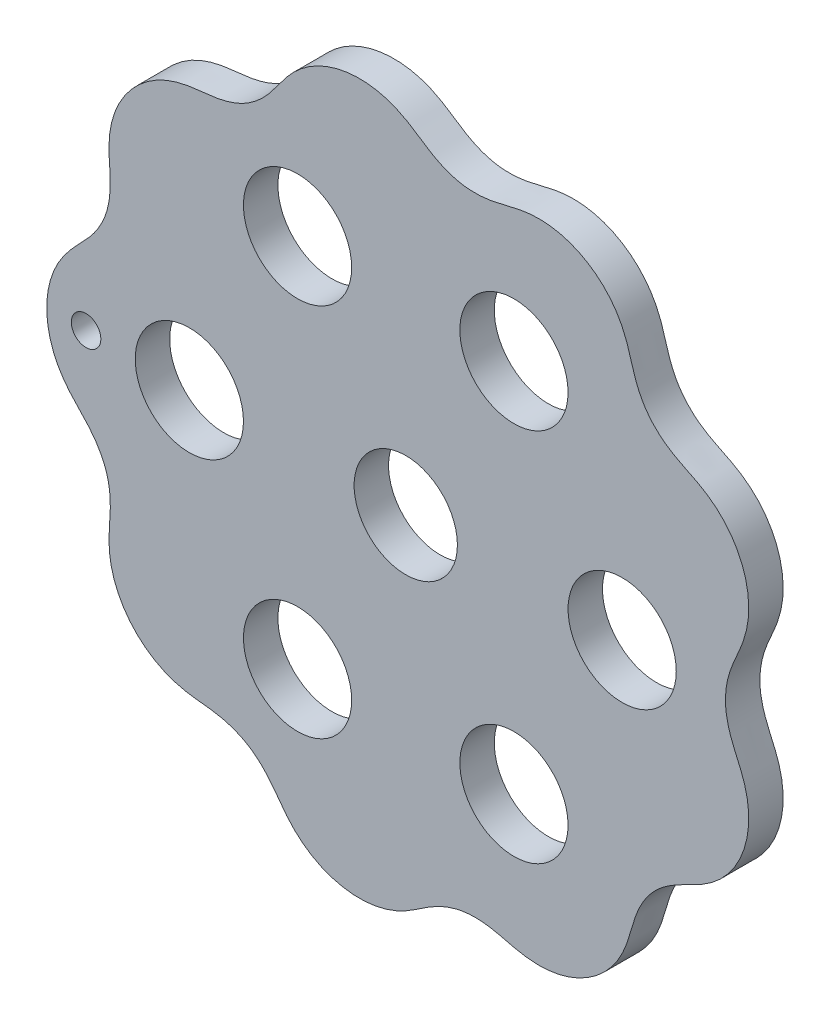
ISO-10303-21;
HEADER;
FILE_DESCRIPTION(('STEP AP214'),'2;1');
FILE_NAME('part.step','',(''),(''),'','','');
FILE_SCHEMA(('AUTOMOTIVE_DESIGN { 1 0 10303 214 1 1 1 1 }'));
ENDSEC;
DATA;
#1=APPLICATION_CONTEXT('core data for automotive mechanical design processes');
#2=APPLICATION_PROTOCOL_DEFINITION('international standard','automotive_design',2000,#1);
#3=PRODUCT_CONTEXT('',#1,'mechanical');
#4=PRODUCT('Part','Part','',(#3));
#5=PRODUCT_RELATED_PRODUCT_CATEGORY('part','',(#4));
#6=PRODUCT_DEFINITION_FORMATION('','',#4);
#7=PRODUCT_DEFINITION_CONTEXT('part definition',#1,'design');
#8=PRODUCT_DEFINITION('design','',#6,#7);
#9=PRODUCT_DEFINITION_SHAPE('','',#8);
#10=(LENGTH_UNIT() NAMED_UNIT(*) SI_UNIT(.MILLI.,.METRE.));
#11=(NAMED_UNIT(*) PLANE_ANGLE_UNIT() SI_UNIT($,.RADIAN.));
#12=(NAMED_UNIT(*) SI_UNIT($,.STERADIAN.) SOLID_ANGLE_UNIT());
#13=UNCERTAINTY_MEASURE_WITH_UNIT(LENGTH_MEASURE(1.E-05),#10,'distance_accuracy_value','');
#14=(GEOMETRIC_REPRESENTATION_CONTEXT(3) GLOBAL_UNCERTAINTY_ASSIGNED_CONTEXT((#13)) GLOBAL_UNIT_ASSIGNED_CONTEXT((#10,
#11,#12)) REPRESENTATION_CONTEXT('',''));
#15=CARTESIAN_POINT('',(0.,0.,0.));
#16=DIRECTION('',(0.,0.,1.));
#17=DIRECTION('',(1.,0.,0.));
#18=AXIS2_PLACEMENT_3D('',#15,#16,#17);
#19=CARTESIAN_POINT('',(64.9999974189462,0.000806947393206427,7.));
#20=CARTESIAN_POINT('',(65.0000060896665,0.210133120043708,7.));
#21=CARTESIAN_POINT('',(65.0075349477926,0.640540930359557,7.));
#22=CARTESIAN_POINT('',(65.0423326642726,1.29138048933978,7.));
#23=CARTESIAN_POINT('',(65.1355944950711,2.15946002252957,7.));
#24=CARTESIAN_POINT('',(65.2772488507312,3.03268000759289,7.));
#25=CARTESIAN_POINT('',(65.4938302034019,4.03856931783916,7.));
#26=CARTESIAN_POINT('',(65.8090879421548,5.16829321058666,7.));
#27=CARTESIAN_POINT('',(66.3609477002479,6.75838675332003,7.));
#28=CARTESIAN_POINT('',(67.1955606372477,8.68035398579398,7.));
#29=CARTESIAN_POINT('',(68.1863534579367,10.8265174950943,7.));
#30=CARTESIAN_POINT('',(69.006376801487,13.1310375512732,7.));
#31=CARTESIAN_POINT('',(69.4920834602597,15.232893555584,7.));
#32=CARTESIAN_POINT('',(69.7787041406788,17.6217517722098,7.));
#33=CARTESIAN_POINT('',(69.7585653837126,20.2836153044852,7.));
#34=CARTESIAN_POINT('',(69.2420504175532,23.3842825140304,7.));
#35=CARTESIAN_POINT('',(67.989755767463,26.7805165454868,7.));
#36=CARTESIAN_POINT('',(66.1003518112437,29.9050606071729,7.));
#37=CARTESIAN_POINT('',(63.9856429027027,32.2244319198111,7.));
#38=CARTESIAN_POINT('',(61.9631798684135,33.8331068866535,7.));
#39=CARTESIAN_POINT('',(59.9243572487797,35.1173421352973,7.));
#40=CARTESIAN_POINT('',(58.0026026370836,36.1114334246741,7.));
#41=CARTESIAN_POINT('',(55.7730199877424,37.1453350716986,7.));
#42=CARTESIAN_POINT('',(53.1577175576554,38.6272333252823,7.));
#43=CARTESIAN_POINT('',(50.6634327190039,40.6124441799345,7.));
#44=CARTESIAN_POINT('',(48.1772443412328,43.6331587744378,7.));
#45=CARTESIAN_POINT('',(46.5494493779002,47.2486226424222,7.));
#46=CARTESIAN_POINT('',(45.6788409974091,50.8530369439028,7.));
#47=CARTESIAN_POINT('',(44.4877142214285,54.37135741296,7.));
#48=CARTESIAN_POINT('',(42.9782258437172,57.2636357878246,7.));
#49=CARTESIAN_POINT('',(40.837389164635,60.0002248973357,7.));
#50=CARTESIAN_POINT('',(38.0491294232779,62.4028462274312,7.));
#51=CARTESIAN_POINT('',(34.8562595704566,64.2262648191676,7.));
#52=CARTESIAN_POINT('',(31.3749966284014,65.4055952018423,7.));
#53=CARTESIAN_POINT('',(27.9067164953287,65.8635360965851,7.));
#54=CARTESIAN_POINT('',(24.5909286352251,65.6863801751534,7.));
#55=CARTESIAN_POINT('',(21.6064914797643,65.0507962498969,7.));
#56=CARTESIAN_POINT('',(18.9163015216464,64.3230768301073,7.));
#57=CARTESIAN_POINT('',(15.9988246409172,63.774192758896,7.));
#58=CARTESIAN_POINT('',(12.8475847319798,63.6680287432577,7.));
#59=CARTESIAN_POINT('',(9.72881655560221,64.2151955286093,7.));
#60=CARTESIAN_POINT('',(6.80201603206665,65.3881481412251,7.));
#61=CARTESIAN_POINT('',(4.24637024670339,66.8988383222155,7.));
#62=CARTESIAN_POINT('',(1.96700879221362,68.5023935980808,7.));
#63=CARTESIAN_POINT('',(-0.618218867674531,70.1231580876928,7.));
#64=CARTESIAN_POINT('',(-3.67158622518901,71.4280302377859,7.));
#65=CARTESIAN_POINT('',(-7.08625472339014,72.188828977834,7.));
#66=CARTESIAN_POINT('',(-10.7607962504432,72.2764501479947,7.));
#67=CARTESIAN_POINT('',(-14.3856478065138,71.6600737291214,7.));
#68=CARTESIAN_POINT('',(-17.8292746131177,70.3608295334047,7.));
#69=CARTESIAN_POINT('',(-20.7796796781894,68.525713642821,7.));
#70=CARTESIAN_POINT('',(-23.1903735111349,66.3275587138377,7.));
#71=CARTESIAN_POINT('',(-25.5166432056723,63.4313883268779,7.));
#72=CARTESIAN_POINT('',(-27.5658981043485,60.3412686281254,7.));
#73=CARTESIAN_POINT('',(-30.3273071823254,57.4961890293646,7.));
#74=CARTESIAN_POINT('',(-33.6934020938998,55.5025400677718,7.));
#75=CARTESIAN_POINT('',(-36.7146686583335,54.4848557995489,7.));
#76=CARTESIAN_POINT('',(-39.3098157041857,54.0464745085796,7.));
#77=CARTESIAN_POINT('',(-41.3839831679042,53.8369304022008,7.));
#78=CARTESIAN_POINT('',(-43.1619113314944,53.6422788237784,7.));
#79=CARTESIAN_POINT('',(-44.638619490762,53.4200818386609,7.));
#80=CARTESIAN_POINT('',(-46.6290143200991,52.9928867622821,7.));
#81=CARTESIAN_POINT('',(-49.0810187762695,52.1759075026816,7.));
#82=CARTESIAN_POINT('',(-51.8634319117081,50.7240398876037,7.));
#83=CARTESIAN_POINT('',(-54.7375351891168,48.4164840592304,7.));
#84=CARTESIAN_POINT('',(-57.1177551209098,45.5983896518703,7.));
#85=CARTESIAN_POINT('',(-58.9151842364942,42.3728498221085,7.));
#86=CARTESIAN_POINT('',(-59.9875054812709,39.0487290248223,7.));
#87=CARTESIAN_POINT('',(-60.406669899066,35.79071175248,7.));
#88=CARTESIAN_POINT('',(-60.3255510791938,32.7522342108345,7.));
#89=CARTESIAN_POINT('',(-60.0723296855861,29.9660658894175,7.));
#90=CARTESIAN_POINT('',(-60.0137605173139,26.9590132260123,7.));
#91=CARTESIAN_POINT('',(-60.4507873217953,23.766104629994,7.));
#92=CARTESIAN_POINT('',(-61.5496316373744,20.7237531942153,7.));
#93=CARTESIAN_POINT('',(-63.2537764880858,17.9881793859017,7.));
#94=CARTESIAN_POINT('',(-64.989814092561,15.9871600919805,7.));
#95=CARTESIAN_POINT('',(-66.4470329388372,14.4993768041449,7.));
#96=CARTESIAN_POINT('',(-67.6572058913901,13.2246424716252,7.));
#97=CARTESIAN_POINT('',(-68.5996720386976,12.146432902912,7.));
#98=CARTESIAN_POINT('',(-69.5367739893671,10.9320496532846,7.));
#99=CARTESIAN_POINT('',(-70.4328124052768,9.56352253746906,7.));
#100=CARTESIAN_POINT('',(-71.2499826492614,8.02969432082017,7.));
#101=CARTESIAN_POINT('',(-71.9504383846823,6.32905817664915,7.));
#102=CARTESIAN_POINT('',(-72.4801341328205,4.56774841811237,7.));
#103=CARTESIAN_POINT('',(-72.835401263682,2.76323725210516,7.));
#104=CARTESIAN_POINT('',(-72.969755124668,1.3873552731175,7.));
#105=CARTESIAN_POINT('',(-72.99987629454,0.466180194334638,7.));
#106=CARTESIAN_POINT('',(-72.9999998938307,0.00404841223115982,7.));
#107=CARTESIAN_POINT('',(-73.0000000524441,0.000971905902284116,7.));
#108=CARTESIAN_POINT('',(-73.0000000607955,0.000809921588441405,7.));
#109=CARTESIAN_POINT('',(-73.0000000673054,0.00064793727450376,7.));
#110=CARTESIAN_POINT('',(-73.0000000766209,0.000323968646429011,7.));
#111=CARTESIAN_POINT('',(-73.000000078484,1.79361577428399E-11,7.));
#112=CARTESIAN_POINT('',(-73.0000000766209,-0.000323968610556695,7.));
#113=CARTESIAN_POINT('',(-73.0000000673054,-0.000647937238631444,7.));
#114=CARTESIAN_POINT('',(-73.0000000607955,-0.000809921552569089,7.));
#115=CARTESIAN_POINT('',(-73.0000000524442,-0.000971905865254023,7.));
#116=CARTESIAN_POINT('',(-72.9999998938307,-0.00404841219528758,7.));
#117=CARTESIAN_POINT('',(-72.9998762945401,-0.466180194298766,7.));
#118=CARTESIAN_POINT('',(-72.9697551246683,-1.38735527308164,7.));
#119=CARTESIAN_POINT('',(-72.8354012636827,-2.76323725206933,7.));
#120=CARTESIAN_POINT('',(-72.4801341328217,-4.56774841807664,7.));
#121=CARTESIAN_POINT('',(-71.950438384684,-6.32905817661355,7.));
#122=CARTESIAN_POINT('',(-71.2499826492635,-8.02969432078475,7.));
#123=CARTESIAN_POINT('',(-70.4328124052793,-9.56352253743386,7.));
#124=CARTESIAN_POINT('',(-69.53677398937,-10.9320496532497,7.));
#125=CARTESIAN_POINT('',(-68.5996720387008,-12.1464329028773,7.));
#126=CARTESIAN_POINT('',(-67.6572058913936,-13.2246424715907,7.));
#127=CARTESIAN_POINT('',(-66.447032938841,-14.4993768041108,7.));
#128=CARTESIAN_POINT('',(-64.9898140925653,-15.9871600919467,7.));
#129=CARTESIAN_POINT('',(-63.2537764880906,-17.9881793858683,7.));
#130=CARTESIAN_POINT('',(-61.5496316373799,-20.7237531941824,7.));
#131=CARTESIAN_POINT('',(-60.4507873218015,-23.7661046299614,7.));
#132=CARTESIAN_POINT('',(-60.013760517321,-26.9590132259799,7.));
#133=CARTESIAN_POINT('',(-60.0723296855939,-29.966065889385,7.));
#134=CARTESIAN_POINT('',(-60.3255510792024,-32.7522342108019,7.));
#135=CARTESIAN_POINT('',(-60.4066698990754,-35.7907117524475,7.));
#136=CARTESIAN_POINT('',(-59.9875054812811,-39.0487290247898,7.));
#137=CARTESIAN_POINT('',(-58.9151842365053,-42.3728498220763,7.));
#138=CARTESIAN_POINT('',(-57.1177551209218,-45.5983896518386,7.));
#139=CARTESIAN_POINT('',(-54.7375351891296,-48.4164840591993,7.));
#140=CARTESIAN_POINT('',(-51.8634319117215,-50.7240398875733,7.));
#141=CARTESIAN_POINT('',(-49.0810187762832,-52.175907502652,7.));
#142=CARTESIAN_POINT('',(-46.629014320113,-52.9928867622531,7.));
#143=CARTESIAN_POINT('',(-44.6386194907761,-53.4200818386325,7.));
#144=CARTESIAN_POINT('',(-43.1619113315086,-53.6422788237504,7.));
#145=CARTESIAN_POINT('',(-41.3839831679183,-53.8369304021733,7.));
#146=CARTESIAN_POINT('',(-39.3098157041999,-54.0464745085526,7.));
#147=CARTESIAN_POINT('',(-36.7146686583478,-54.4848557995226,7.));
#148=CARTESIAN_POINT('',(-33.6934020939144,-55.5025400677462,7.));
#149=CARTESIAN_POINT('',(-30.3273071823405,-57.4961890293399,7.));
#150=CARTESIAN_POINT('',(-27.5658981043644,-60.3412686281015,7.));
#151=CARTESIAN_POINT('',(-25.516643205689,-63.4313883268545,7.));
#152=CARTESIAN_POINT('',(-23.1903735111523,-66.3275587138149,7.));
#153=CARTESIAN_POINT('',(-20.7796796782074,-68.5257136427989,7.));
#154=CARTESIAN_POINT('',(-17.8292746131362,-70.3608295333833,7.));
#155=CARTESIAN_POINT('',(-14.3856478065326,-71.660073729101,7.));
#156=CARTESIAN_POINT('',(-10.7607962504622,-72.2764501479752,7.));
#157=CARTESIAN_POINT('',(-7.08625472340912,-72.1888289778155,7.));
#158=CARTESIAN_POINT('',(-3.67158622520779,-71.4280302377683,7.));
#159=CARTESIAN_POINT('',(-0.618218867692968,-70.123158087676,7.));
#160=CARTESIAN_POINT('',(1.96700879219561,-68.5023935980646,7.));
#161=CARTESIAN_POINT('',(4.2463702466858,-66.8988383221999,7.));
#162=CARTESIAN_POINT('',(6.80201603204946,-65.3881481412102,7.));
#163=CARTESIAN_POINT('',(9.72881655558533,-64.2151955285952,7.));
#164=CARTESIAN_POINT('',(12.8475847319631,-63.6680287432444,7.));
#165=CARTESIAN_POINT('',(15.9988246409004,-63.7741927588835,7.));
#166=CARTESIAN_POINT('',(18.9163015216295,-64.3230768300955,7.));
#167=CARTESIAN_POINT('',(21.6064914797472,-65.0507962498859,7.));
#168=CARTESIAN_POINT('',(24.5909286352079,-65.6863801751432,7.));
#169=CARTESIAN_POINT('',(27.9067164953114,-65.8635360965757,7.));
#170=CARTESIAN_POINT('',(31.3749966283842,-65.4055952018339,7.));
#171=CARTESIAN_POINT('',(34.8562595704397,-64.2262648191601,7.));
#172=CARTESIAN_POINT('',(38.0491294232615,-62.4028462274245,7.));
#173=CARTESIAN_POINT('',(40.8373891646192,-60.0002248973298,7.));
#174=CARTESIAN_POINT('',(42.9782258437022,-57.2636357878192,7.));
#175=CARTESIAN_POINT('',(44.4877142214142,-54.371357412955,7.));
#176=CARTESIAN_POINT('',(45.6788409973957,-50.8530369438981,7.));
#177=CARTESIAN_POINT('',(46.5494493778878,-47.2486226424178,7.));
#178=CARTESIAN_POINT('',(48.1772443412213,-43.6331587744338,7.));
#179=CARTESIAN_POINT('',(50.6634327189932,-40.6124441799311,7.));
#180=CARTESIAN_POINT('',(53.1577175576452,-38.6272333252796,7.));
#181=CARTESIAN_POINT('',(55.7730199877326,-37.1453350716966,7.));
#182=CARTESIAN_POINT('',(58.0026026370741,-36.1114334246727,7.));
#183=CARTESIAN_POINT('',(59.9243572487705,-35.1173421352963,7.));
#184=CARTESIAN_POINT('',(61.9631798684046,-33.8331068866531,7.));
#185=CARTESIAN_POINT('',(63.9856429026942,-32.2244319198112,7.));
#186=CARTESIAN_POINT('',(66.1003518112358,-29.9050606071735,7.));
#187=CARTESIAN_POINT('',(67.9897557674559,-26.780516545488,7.));
#188=CARTESIAN_POINT('',(69.242050417547,-23.3842825140319,7.));
#189=CARTESIAN_POINT('',(69.7585653837073,-20.2836153044868,7.));
#190=CARTESIAN_POINT('',(69.7787041406742,-17.6217517722115,7.));
#191=CARTESIAN_POINT('',(69.4920834602557,-15.2328935555856,7.));
#192=CARTESIAN_POINT('',(69.0063768014836,-13.1310375512746,7.));
#193=CARTESIAN_POINT('',(68.1863534579339,-10.8265174950955,7.));
#194=CARTESIAN_POINT('',(67.1955606372454,-8.68035398579494,7.));
#195=CARTESIAN_POINT('',(66.3609477002461,-6.75838675332078,7.));
#196=CARTESIAN_POINT('',(65.8090879421534,-5.16829321058725,7.));
#197=CARTESIAN_POINT('',(65.4938302034009,-4.03856931783967,7.));
#198=CARTESIAN_POINT('',(65.2772488507304,-3.03268000759335,7.));
#199=CARTESIAN_POINT('',(65.1355944950705,-2.15946002252999,7.));
#200=CARTESIAN_POINT('',(65.0423326642722,-1.29138048934017,7.));
#201=CARTESIAN_POINT('',(65.0075349477925,-0.640540930359938,7.));
#202=CARTESIAN_POINT('',(65.0000060896664,-0.210133120044085,7.));
#203=CARTESIAN_POINT('',(64.9999974189462,-0.000806947393581314,7.));
#204=CARTESIAN_POINT('',(64.9999974133753,-0.000672456161464381,7.));
#205=CARTESIAN_POINT('',(64.9999974093124,-0.000537964929284987,7.));
#206=CARTESIAN_POINT('',(64.9999974037974,-0.00026898246482123,7.));
#207=CARTESIAN_POINT('',(64.9999974026943,-1.8744353402282E-13,7.));
#208=CARTESIAN_POINT('',(64.9999974037973,0.000268982464446343,7.));
#209=CARTESIAN_POINT('',(64.9999974093124,0.0005379649289101,7.));
#210=CARTESIAN_POINT('',(64.9999974133753,0.000672456161089494,7.));
#211=CARTESIAN_POINT('',(64.9999974189462,0.000806947393206427,7.));
#212=B_SPLINE_CURVE_WITH_KNOTS('',4,(#19,#20,#21,#22,#23,#24,#25,#26,#27,#28,#29,#30,#31,#32,
#33,#34,#35,#36,#37,#38,#39,#40,#41,#42,#43,#44,#45,#46,#47,#48,#49,#50,#51,#52,#53,#54,#55,#56,
#57,#58,#59,#60,#61,#62,#63,#64,#65,#66,#67,#68,#69,#70,#71,#72,#73,#74,#75,#76,#77,#78,#79,#80,
#81,#82,#83,#84,#85,#86,#87,#88,#89,#90,#91,#92,#93,#94,#95,#96,#97,#98,#99,#100,#101,#102,#103,
#104,#105,#106,#107,#108,#109,#110,#111,#112,#113,#114,#115,#116,#117,#118,#119,#120,#121,#122,
#123,#124,#125,#126,#127,#128,#129,#130,#131,#132,#133,#134,#135,#136,#137,#138,#139,#140,#141,
#142,#143,#144,#145,#146,#147,#148,#149,#150,#151,#152,#153,#154,#155,#156,#157,#158,#159,#160,
#161,#162,#163,#164,#165,#166,#167,#168,#169,#170,#171,#172,#173,#174,#175,#176,#177,#178,#179,
#180,#181,#182,#183,#184,#185,#186,#187,#188,#189,#190,#191,#192,#193,#194,#195,#196,#197,#198,
#199,#200,#201,#202,#203,#204,#205,#206,#207,#208,#209,#210,#211),.UNSPECIFIED.,.T.,.F.,(5,1,1,
1,1,1,1,1,1,1,1,1,1,1,1,1,1,1,1,1,1,1,1,1,1,1,1,1,1,1,1,1,1,1,1,1,1,1,1,1,1,1,1,1,1,1,1,1,1,1,1,
1,1,1,1,1,1,1,1,1,1,1,1,1,1,1,1,1,1,1,1,1,1,1,1,1,1,1,1,1,1,1,1,1,1,4,2,2,4,1,1,1,1,1,1,1,1,1,1,
1,1,1,1,1,1,1,1,1,1,1,1,1,1,1,1,1,1,1,1,1,1,1,1,1,1,1,1,1,1,1,1,1,1,1,1,1,1,1,1,1,1,1,1,1,1,1,1,
1,1,1,1,1,1,1,1,1,1,1,1,1,1,1,1,1,1,1,1,1,1,1,1,1,1,4,2,2,5),(0.,0.00179877679357395,
0.00369860318866866,0.00559842958376338,0.0074982559788581,0.00939808237395283,
0.0125354173057919,0.015672752237631,0.0219474221013093,0.0273968380286471,0.032846253955985,
0.036645322562363,0.0404443911687411,0.0480417138040207,0.0556394037325636,0.0635014330407862,
0.0713638329503387,0.0792260579401196,0.0824323907924654,0.0856387236448112,0.0920513893495028,
0.0978019915695772,0.103552593789651,0.111417655754904,0.119282982658091,0.131114720690952,
0.13719636747454,0.143278014258127,0.151140148936298,0.159002594053197,0.166864609699459,
0.17470558558049,0.182546938898735,0.190388195673256,0.196737093948422,0.203085992223588,
0.208716670757051,0.214347349290514,0.222191946311898,0.230036411362514,0.235667158889129,
0.241297906415744,0.24764682768202,0.253995748948295,0.261837004604368,0.269678346555616,
0.277519325419182,0.285381338387372,0.293243790997148,0.301105902295292,0.307187582450527,
0.313269262605762,0.325100906035947,0.332966248770787,0.340831069770045,0.346581786892535,
0.352332504015025,0.35553884588345,0.358745187751876,0.361951529620301,0.365157871488727,
0.37302010918035,0.380882498425008,0.388744530518058,0.396634104342138,0.404524031544877,
0.412413637757737,0.418564341599305,0.424715045440873,0.430589756447976,0.436464467455079,
0.444357156095167,0.452249356514838,0.458124313656491,0.463999270798145,0.467074598109372,
0.470149925420598,0.473225252731825,0.476300580043052,0.48024542152947,0.484190263015888,
0.488135211230797,0.492080159445706,0.496024950319041,0.499969741192377,0.499996178474609,
0.499997570451275,0.49999896242794,0.500000354404606,0.500026791686838,0.503971582560174,
0.507916373433509,0.511861321648418,0.515806269863328,0.519751111349746,0.523695952836164,
0.52677128014739,0.529846607458617,0.532921934769844,0.535997262081071,0.541872219222724,
0.547747176364378,0.555639376784049,0.563532065424137,0.569406776431241,0.575281487438344,
0.581432191279912,0.58758289512148,0.59547250133434,0.603362428537079,0.611252002361159,
0.619114034454209,0.626976423698868,0.634838661390491,0.638045003258917,0.641251345127342,
0.644457686995768,0.647664028864193,0.653414745986683,0.659165463109173,0.667030284108431,
0.674895626843271,0.686727270273457,0.692808950428692,0.698890630583927,0.706752741882072,
0.714615194491847,0.722477207460038,0.730318186323604,0.738159528274852,0.746000783930925,
0.752349705197201,0.758698626463477,0.764329373990092,0.769960121516707,0.777804586567323,
0.785649183588708,0.791279862122171,0.796910540655634,0.803259438930799,0.809608337205965,
0.817449593980487,0.825290947298732,0.833131923179763,0.840993938826025,0.848856383942924,
0.856718518621095,0.862800165404683,0.868881812188271,0.880713550221132,0.888578877124319,
0.896443939089572,0.902194541309646,0.907945143529721,0.914357809234413,0.917564142086758,
0.920770474939104,0.928632699928885,0.936495099838438,0.944357129146661,0.951954819075204,
0.959552141710484,0.963351210316862,0.96715027892324,0.972599694850578,0.978049110777916,
0.984323780641594,0.987461115573433,0.990598450505273,0.992498276900367,0.994398103295462,
0.996297929690557,0.998197756085651,0.999996532879226,0.99999768858615,0.999998844293075,1.),.UNSPECIFIED.);
#213=DIRECTION('',(0.,0.,-1.));
#214=VECTOR('',#213,1.);
#215=SURFACE_OF_LINEAR_EXTRUSION('',#212,#214);
#216=CARTESIAN_POINT('',(64.9999974189462,0.000806947393206427,7.));
#217=VERTEX_POINT('',#216);
#218=EDGE_CURVE('E10',#217,#217,#212,.T.);
#219=ORIENTED_EDGE('',*,*,#218,.F.);
#220=EDGE_LOOP('',(#219));
#221=FACE_BOUND('',#220,.T.);
#222=CARTESIAN_POINT('',(64.9999974189462,0.000806947393206427,0.));
#223=CARTESIAN_POINT('',(65.0000060896665,0.210133120043708,0.));
#224=CARTESIAN_POINT('',(65.0075349477926,0.640540930359557,0.));
#225=CARTESIAN_POINT('',(65.0423326642726,1.29138048933978,0.));
#226=CARTESIAN_POINT('',(65.1355944950711,2.15946002252957,0.));
#227=CARTESIAN_POINT('',(65.2772488507312,3.03268000759289,0.));
#228=CARTESIAN_POINT('',(65.4938302034019,4.03856931783916,0.));
#229=CARTESIAN_POINT('',(65.8090879421548,5.16829321058666,0.));
#230=CARTESIAN_POINT('',(66.3609477002479,6.75838675332003,0.));
#231=CARTESIAN_POINT('',(67.1955606372477,8.68035398579398,0.));
#232=CARTESIAN_POINT('',(68.1863534579367,10.8265174950943,0.));
#233=CARTESIAN_POINT('',(69.006376801487,13.1310375512732,0.));
#234=CARTESIAN_POINT('',(69.4920834602597,15.232893555584,0.));
#235=CARTESIAN_POINT('',(69.7787041406788,17.6217517722098,0.));
#236=CARTESIAN_POINT('',(69.7585653837126,20.2836153044852,0.));
#237=CARTESIAN_POINT('',(69.2420504175532,23.3842825140304,0.));
#238=CARTESIAN_POINT('',(67.989755767463,26.7805165454868,0.));
#239=CARTESIAN_POINT('',(66.1003518112437,29.9050606071729,0.));
#240=CARTESIAN_POINT('',(63.9856429027027,32.2244319198111,0.));
#241=CARTESIAN_POINT('',(61.9631798684135,33.8331068866535,0.));
#242=CARTESIAN_POINT('',(59.9243572487797,35.1173421352973,0.));
#243=CARTESIAN_POINT('',(58.0026026370836,36.1114334246741,0.));
#244=CARTESIAN_POINT('',(55.7730199877424,37.1453350716986,0.));
#245=CARTESIAN_POINT('',(53.1577175576554,38.6272333252823,0.));
#246=CARTESIAN_POINT('',(50.6634327190039,40.6124441799345,0.));
#247=CARTESIAN_POINT('',(48.1772443412328,43.6331587744378,0.));
#248=CARTESIAN_POINT('',(46.5494493779002,47.2486226424222,0.));
#249=CARTESIAN_POINT('',(45.6788409974091,50.8530369439028,0.));
#250=CARTESIAN_POINT('',(44.4877142214285,54.37135741296,0.));
#251=CARTESIAN_POINT('',(42.9782258437172,57.2636357878246,0.));
#252=CARTESIAN_POINT('',(40.837389164635,60.0002248973357,0.));
#253=CARTESIAN_POINT('',(38.0491294232779,62.4028462274312,0.));
#254=CARTESIAN_POINT('',(34.8562595704566,64.2262648191676,0.));
#255=CARTESIAN_POINT('',(31.3749966284014,65.4055952018423,0.));
#256=CARTESIAN_POINT('',(27.9067164953287,65.8635360965851,0.));
#257=CARTESIAN_POINT('',(24.5909286352251,65.6863801751534,0.));
#258=CARTESIAN_POINT('',(21.6064914797643,65.0507962498969,0.));
#259=CARTESIAN_POINT('',(18.9163015216464,64.3230768301073,0.));
#260=CARTESIAN_POINT('',(15.9988246409172,63.774192758896,0.));
#261=CARTESIAN_POINT('',(12.8475847319798,63.6680287432577,0.));
#262=CARTESIAN_POINT('',(9.72881655560221,64.2151955286093,0.));
#263=CARTESIAN_POINT('',(6.80201603206665,65.3881481412251,0.));
#264=CARTESIAN_POINT('',(4.24637024670339,66.8988383222155,0.));
#265=CARTESIAN_POINT('',(1.96700879221362,68.5023935980808,0.));
#266=CARTESIAN_POINT('',(-0.618218867674531,70.1231580876928,0.));
#267=CARTESIAN_POINT('',(-3.67158622518901,71.4280302377859,0.));
#268=CARTESIAN_POINT('',(-7.08625472339014,72.188828977834,0.));
#269=CARTESIAN_POINT('',(-10.7607962504432,72.2764501479947,0.));
#270=CARTESIAN_POINT('',(-14.3856478065138,71.6600737291214,0.));
#271=CARTESIAN_POINT('',(-17.8292746131177,70.3608295334047,0.));
#272=CARTESIAN_POINT('',(-20.7796796781894,68.525713642821,0.));
#273=CARTESIAN_POINT('',(-23.1903735111349,66.3275587138377,0.));
#274=CARTESIAN_POINT('',(-25.5166432056723,63.4313883268779,0.));
#275=CARTESIAN_POINT('',(-27.5658981043485,60.3412686281254,0.));
#276=CARTESIAN_POINT('',(-30.3273071823254,57.4961890293646,0.));
#277=CARTESIAN_POINT('',(-33.6934020938998,55.5025400677718,0.));
#278=CARTESIAN_POINT('',(-36.7146686583335,54.4848557995489,0.));
#279=CARTESIAN_POINT('',(-39.3098157041857,54.0464745085796,0.));
#280=CARTESIAN_POINT('',(-41.3839831679042,53.8369304022008,0.));
#281=CARTESIAN_POINT('',(-43.1619113314944,53.6422788237784,0.));
#282=CARTESIAN_POINT('',(-44.638619490762,53.4200818386609,0.));
#283=CARTESIAN_POINT('',(-46.6290143200991,52.9928867622821,0.));
#284=CARTESIAN_POINT('',(-49.0810187762695,52.1759075026816,0.));
#285=CARTESIAN_POINT('',(-51.8634319117081,50.7240398876037,0.));
#286=CARTESIAN_POINT('',(-54.7375351891168,48.4164840592304,0.));
#287=CARTESIAN_POINT('',(-57.1177551209098,45.5983896518703,0.));
#288=CARTESIAN_POINT('',(-58.9151842364942,42.3728498221085,0.));
#289=CARTESIAN_POINT('',(-59.9875054812709,39.0487290248223,0.));
#290=CARTESIAN_POINT('',(-60.406669899066,35.79071175248,0.));
#291=CARTESIAN_POINT('',(-60.3255510791938,32.7522342108345,0.));
#292=CARTESIAN_POINT('',(-60.0723296855861,29.9660658894175,0.));
#293=CARTESIAN_POINT('',(-60.0137605173139,26.9590132260123,0.));
#294=CARTESIAN_POINT('',(-60.4507873217953,23.766104629994,0.));
#295=CARTESIAN_POINT('',(-61.5496316373744,20.7237531942153,0.));
#296=CARTESIAN_POINT('',(-63.2537764880858,17.9881793859017,0.));
#297=CARTESIAN_POINT('',(-64.989814092561,15.9871600919805,0.));
#298=CARTESIAN_POINT('',(-66.4470329388372,14.4993768041449,0.));
#299=CARTESIAN_POINT('',(-67.6572058913901,13.2246424716252,0.));
#300=CARTESIAN_POINT('',(-68.5996720386976,12.146432902912,0.));
#301=CARTESIAN_POINT('',(-69.5367739893671,10.9320496532846,0.));
#302=CARTESIAN_POINT('',(-70.4328124052768,9.56352253746906,0.));
#303=CARTESIAN_POINT('',(-71.2499826492614,8.02969432082017,0.));
#304=CARTESIAN_POINT('',(-71.9504383846823,6.32905817664915,0.));
#305=CARTESIAN_POINT('',(-72.4801341328205,4.56774841811237,0.));
#306=CARTESIAN_POINT('',(-72.835401263682,2.76323725210516,0.));
#307=CARTESIAN_POINT('',(-72.969755124668,1.3873552731175,0.));
#308=CARTESIAN_POINT('',(-72.99987629454,0.466180194334638,0.));
#309=CARTESIAN_POINT('',(-72.9999998938307,0.00404841223115982,0.));
#310=CARTESIAN_POINT('',(-73.0000000524441,0.000971905902284116,0.));
#311=CARTESIAN_POINT('',(-73.0000000607955,0.000809921588441405,0.));
#312=CARTESIAN_POINT('',(-73.0000000673054,0.00064793727450376,0.));
#313=CARTESIAN_POINT('',(-73.0000000766209,0.000323968646429011,0.));
#314=CARTESIAN_POINT('',(-73.000000078484,1.79361577428399E-11,0.));
#315=CARTESIAN_POINT('',(-73.0000000766209,-0.000323968610556695,0.));
#316=CARTESIAN_POINT('',(-73.0000000673054,-0.000647937238631444,0.));
#317=CARTESIAN_POINT('',(-73.0000000607955,-0.000809921552569089,0.));
#318=CARTESIAN_POINT('',(-73.0000000524442,-0.000971905865254023,0.));
#319=CARTESIAN_POINT('',(-72.9999998938307,-0.00404841219528758,0.));
#320=CARTESIAN_POINT('',(-72.9998762945401,-0.466180194298766,0.));
#321=CARTESIAN_POINT('',(-72.9697551246683,-1.38735527308164,0.));
#322=CARTESIAN_POINT('',(-72.8354012636827,-2.76323725206933,0.));
#323=CARTESIAN_POINT('',(-72.4801341328217,-4.56774841807664,0.));
#324=CARTESIAN_POINT('',(-71.950438384684,-6.32905817661355,0.));
#325=CARTESIAN_POINT('',(-71.2499826492635,-8.02969432078475,0.));
#326=CARTESIAN_POINT('',(-70.4328124052793,-9.56352253743386,0.));
#327=CARTESIAN_POINT('',(-69.53677398937,-10.9320496532497,0.));
#328=CARTESIAN_POINT('',(-68.5996720387008,-12.1464329028773,0.));
#329=CARTESIAN_POINT('',(-67.6572058913936,-13.2246424715907,0.));
#330=CARTESIAN_POINT('',(-66.447032938841,-14.4993768041108,0.));
#331=CARTESIAN_POINT('',(-64.9898140925653,-15.9871600919467,0.));
#332=CARTESIAN_POINT('',(-63.2537764880906,-17.9881793858683,0.));
#333=CARTESIAN_POINT('',(-61.5496316373799,-20.7237531941824,0.));
#334=CARTESIAN_POINT('',(-60.4507873218015,-23.7661046299614,0.));
#335=CARTESIAN_POINT('',(-60.013760517321,-26.9590132259799,0.));
#336=CARTESIAN_POINT('',(-60.0723296855939,-29.966065889385,0.));
#337=CARTESIAN_POINT('',(-60.3255510792024,-32.7522342108019,0.));
#338=CARTESIAN_POINT('',(-60.4066698990754,-35.7907117524475,0.));
#339=CARTESIAN_POINT('',(-59.9875054812811,-39.0487290247898,0.));
#340=CARTESIAN_POINT('',(-58.9151842365053,-42.3728498220763,0.));
#341=CARTESIAN_POINT('',(-57.1177551209218,-45.5983896518386,0.));
#342=CARTESIAN_POINT('',(-54.7375351891296,-48.4164840591993,0.));
#343=CARTESIAN_POINT('',(-51.8634319117215,-50.7240398875733,0.));
#344=CARTESIAN_POINT('',(-49.0810187762832,-52.175907502652,0.));
#345=CARTESIAN_POINT('',(-46.629014320113,-52.9928867622531,0.));
#346=CARTESIAN_POINT('',(-44.6386194907761,-53.4200818386325,0.));
#347=CARTESIAN_POINT('',(-43.1619113315086,-53.6422788237504,0.));
#348=CARTESIAN_POINT('',(-41.3839831679183,-53.8369304021733,0.));
#349=CARTESIAN_POINT('',(-39.3098157041999,-54.0464745085526,0.));
#350=CARTESIAN_POINT('',(-36.7146686583478,-54.4848557995226,0.));
#351=CARTESIAN_POINT('',(-33.6934020939144,-55.5025400677462,0.));
#352=CARTESIAN_POINT('',(-30.3273071823405,-57.4961890293399,0.));
#353=CARTESIAN_POINT('',(-27.5658981043644,-60.3412686281015,0.));
#354=CARTESIAN_POINT('',(-25.516643205689,-63.4313883268545,0.));
#355=CARTESIAN_POINT('',(-23.1903735111523,-66.3275587138149,0.));
#356=CARTESIAN_POINT('',(-20.7796796782074,-68.5257136427989,0.));
#357=CARTESIAN_POINT('',(-17.8292746131362,-70.3608295333833,0.));
#358=CARTESIAN_POINT('',(-14.3856478065326,-71.660073729101,0.));
#359=CARTESIAN_POINT('',(-10.7607962504622,-72.2764501479752,0.));
#360=CARTESIAN_POINT('',(-7.08625472340912,-72.1888289778155,0.));
#361=CARTESIAN_POINT('',(-3.67158622520779,-71.4280302377683,0.));
#362=CARTESIAN_POINT('',(-0.618218867692968,-70.123158087676,0.));
#363=CARTESIAN_POINT('',(1.96700879219561,-68.5023935980646,0.));
#364=CARTESIAN_POINT('',(4.2463702466858,-66.8988383221999,0.));
#365=CARTESIAN_POINT('',(6.80201603204946,-65.3881481412102,0.));
#366=CARTESIAN_POINT('',(9.72881655558533,-64.2151955285952,0.));
#367=CARTESIAN_POINT('',(12.8475847319631,-63.6680287432444,0.));
#368=CARTESIAN_POINT('',(15.9988246409004,-63.7741927588835,0.));
#369=CARTESIAN_POINT('',(18.9163015216295,-64.3230768300955,0.));
#370=CARTESIAN_POINT('',(21.6064914797472,-65.0507962498859,0.));
#371=CARTESIAN_POINT('',(24.5909286352079,-65.6863801751432,0.));
#372=CARTESIAN_POINT('',(27.9067164953114,-65.8635360965757,0.));
#373=CARTESIAN_POINT('',(31.3749966283842,-65.4055952018339,0.));
#374=CARTESIAN_POINT('',(34.8562595704397,-64.2262648191601,0.));
#375=CARTESIAN_POINT('',(38.0491294232615,-62.4028462274245,0.));
#376=CARTESIAN_POINT('',(40.8373891646192,-60.0002248973298,0.));
#377=CARTESIAN_POINT('',(42.9782258437022,-57.2636357878192,0.));
#378=CARTESIAN_POINT('',(44.4877142214142,-54.371357412955,0.));
#379=CARTESIAN_POINT('',(45.6788409973957,-50.8530369438981,0.));
#380=CARTESIAN_POINT('',(46.5494493778878,-47.2486226424178,0.));
#381=CARTESIAN_POINT('',(48.1772443412213,-43.6331587744338,0.));
#382=CARTESIAN_POINT('',(50.6634327189932,-40.6124441799311,0.));
#383=CARTESIAN_POINT('',(53.1577175576452,-38.6272333252796,0.));
#384=CARTESIAN_POINT('',(55.7730199877326,-37.1453350716966,0.));
#385=CARTESIAN_POINT('',(58.0026026370741,-36.1114334246727,0.));
#386=CARTESIAN_POINT('',(59.9243572487705,-35.1173421352963,0.));
#387=CARTESIAN_POINT('',(61.9631798684046,-33.8331068866531,0.));
#388=CARTESIAN_POINT('',(63.9856429026942,-32.2244319198112,0.));
#389=CARTESIAN_POINT('',(66.1003518112358,-29.9050606071735,0.));
#390=CARTESIAN_POINT('',(67.9897557674559,-26.780516545488,0.));
#391=CARTESIAN_POINT('',(69.242050417547,-23.3842825140319,0.));
#392=CARTESIAN_POINT('',(69.7585653837073,-20.2836153044868,0.));
#393=CARTESIAN_POINT('',(69.7787041406742,-17.6217517722115,0.));
#394=CARTESIAN_POINT('',(69.4920834602557,-15.2328935555856,0.));
#395=CARTESIAN_POINT('',(69.0063768014836,-13.1310375512746,0.));
#396=CARTESIAN_POINT('',(68.1863534579339,-10.8265174950955,0.));
#397=CARTESIAN_POINT('',(67.1955606372454,-8.68035398579494,0.));
#398=CARTESIAN_POINT('',(66.3609477002461,-6.75838675332078,0.));
#399=CARTESIAN_POINT('',(65.8090879421534,-5.16829321058725,0.));
#400=CARTESIAN_POINT('',(65.4938302034009,-4.03856931783967,0.));
#401=CARTESIAN_POINT('',(65.2772488507304,-3.03268000759335,0.));
#402=CARTESIAN_POINT('',(65.1355944950705,-2.15946002252999,0.));
#403=CARTESIAN_POINT('',(65.0423326642722,-1.29138048934017,0.));
#404=CARTESIAN_POINT('',(65.0075349477925,-0.640540930359938,0.));
#405=CARTESIAN_POINT('',(65.0000060896664,-0.210133120044085,0.));
#406=CARTESIAN_POINT('',(64.9999974189462,-0.000806947393581314,0.));
#407=CARTESIAN_POINT('',(64.9999974133753,-0.000672456161464381,0.));
#408=CARTESIAN_POINT('',(64.9999974093124,-0.000537964929284987,0.));
#409=CARTESIAN_POINT('',(64.9999974037974,-0.00026898246482123,0.));
#410=CARTESIAN_POINT('',(64.9999974026943,-1.8744353402282E-13,0.));
#411=CARTESIAN_POINT('',(64.9999974037973,0.000268982464446343,0.));
#412=CARTESIAN_POINT('',(64.9999974093124,0.0005379649289101,0.));
#413=CARTESIAN_POINT('',(64.9999974133753,0.000672456161089494,0.));
#414=CARTESIAN_POINT('',(64.9999974189462,0.000806947393206427,0.));
#415=B_SPLINE_CURVE_WITH_KNOTS('',4,(#222,#223,#224,#225,#226,#227,#228,#229,#230,#231,#232,
#233,#234,#235,#236,#237,#238,#239,#240,#241,#242,#243,#244,#245,#246,#247,#248,#249,#250,#251,
#252,#253,#254,#255,#256,#257,#258,#259,#260,#261,#262,#263,#264,#265,#266,#267,#268,#269,#270,
#271,#272,#273,#274,#275,#276,#277,#278,#279,#280,#281,#282,#283,#284,#285,#286,#287,#288,#289,
#290,#291,#292,#293,#294,#295,#296,#297,#298,#299,#300,#301,#302,#303,#304,#305,#306,#307,#308,
#309,#310,#311,#312,#313,#314,#315,#316,#317,#318,#319,#320,#321,#322,#323,#324,#325,#326,#327,
#328,#329,#330,#331,#332,#333,#334,#335,#336,#337,#338,#339,#340,#341,#342,#343,#344,#345,#346,
#347,#348,#349,#350,#351,#352,#353,#354,#355,#356,#357,#358,#359,#360,#361,#362,#363,#364,#365,
#366,#367,#368,#369,#370,#371,#372,#373,#374,#375,#376,#377,#378,#379,#380,#381,#382,#383,#384,
#385,#386,#387,#388,#389,#390,#391,#392,#393,#394,#395,#396,#397,#398,#399,#400,#401,#402,#403,
#404,#405,#406,#407,#408,#409,#410,#411,#412,#413,#414),.UNSPECIFIED.,.T.,.F.,(5,1,1,1,1,1,1,1,
1,1,1,1,1,1,1,1,1,1,1,1,1,1,1,1,1,1,1,1,1,1,1,1,1,1,1,1,1,1,1,1,1,1,1,1,1,1,1,1,1,1,1,1,1,1,1,1,
1,1,1,1,1,1,1,1,1,1,1,1,1,1,1,1,1,1,1,1,1,1,1,1,1,1,1,1,1,4,2,2,4,1,1,1,1,1,1,1,1,1,1,1,1,1,1,1,
1,1,1,1,1,1,1,1,1,1,1,1,1,1,1,1,1,1,1,1,1,1,1,1,1,1,1,1,1,1,1,1,1,1,1,1,1,1,1,1,1,1,1,1,1,1,1,1,
1,1,1,1,1,1,1,1,1,1,1,1,1,1,1,1,1,1,1,1,1,4,2,2,5),(0.,0.00179877679357395,0.00369860318866866,
0.00559842958376338,0.0074982559788581,0.00939808237395283,0.0125354173057919,0.015672752237631,
0.0219474221013093,0.0273968380286471,0.032846253955985,0.036645322562363,0.0404443911687411,
0.0480417138040207,0.0556394037325636,0.0635014330407862,0.0713638329503387,0.0792260579401196,
0.0824323907924654,0.0856387236448112,0.0920513893495028,0.0978019915695772,0.103552593789651,
0.111417655754904,0.119282982658091,0.131114720690952,0.13719636747454,0.143278014258127,
0.151140148936298,0.159002594053197,0.166864609699459,0.17470558558049,0.182546938898735,
0.190388195673256,0.196737093948422,0.203085992223588,0.208716670757051,0.214347349290514,
0.222191946311898,0.230036411362514,0.235667158889129,0.241297906415744,0.24764682768202,
0.253995748948295,0.261837004604368,0.269678346555616,0.277519325419182,0.285381338387372,
0.293243790997148,0.301105902295292,0.307187582450527,0.313269262605762,0.325100906035947,
0.332966248770787,0.340831069770045,0.346581786892535,0.352332504015025,0.35553884588345,
0.358745187751876,0.361951529620301,0.365157871488727,0.37302010918035,0.380882498425008,
0.388744530518058,0.396634104342138,0.404524031544877,0.412413637757737,0.418564341599305,
0.424715045440873,0.430589756447976,0.436464467455079,0.444357156095167,0.452249356514838,
0.458124313656491,0.463999270798145,0.467074598109372,0.470149925420598,0.473225252731825,
0.476300580043052,0.48024542152947,0.484190263015888,0.488135211230797,0.492080159445706,
0.496024950319041,0.499969741192377,0.499996178474609,0.499997570451275,0.49999896242794,
0.500000354404606,0.500026791686838,0.503971582560174,0.507916373433509,0.511861321648418,
0.515806269863328,0.519751111349746,0.523695952836164,0.52677128014739,0.529846607458617,
0.532921934769844,0.535997262081071,0.541872219222724,0.547747176364378,0.555639376784049,
0.563532065424137,0.569406776431241,0.575281487438344,0.581432191279912,0.58758289512148,
0.59547250133434,0.603362428537079,0.611252002361159,0.619114034454209,0.626976423698868,
0.634838661390491,0.638045003258917,0.641251345127342,0.644457686995768,0.647664028864193,
0.653414745986683,0.659165463109173,0.667030284108431,0.674895626843271,0.686727270273457,
0.692808950428692,0.698890630583927,0.706752741882072,0.714615194491847,0.722477207460038,
0.730318186323604,0.738159528274852,0.746000783930925,0.752349705197201,0.758698626463477,
0.764329373990092,0.769960121516707,0.777804586567323,0.785649183588708,0.791279862122171,
0.796910540655634,0.803259438930799,0.809608337205965,0.817449593980487,0.825290947298732,
0.833131923179763,0.840993938826025,0.848856383942924,0.856718518621095,0.862800165404683,
0.868881812188271,0.880713550221132,0.888578877124319,0.896443939089572,0.902194541309646,
0.907945143529721,0.914357809234413,0.917564142086758,0.920770474939104,0.928632699928885,
0.936495099838438,0.944357129146661,0.951954819075204,0.959552141710484,0.963351210316862,
0.96715027892324,0.972599694850578,0.978049110777916,0.984323780641594,0.987461115573433,
0.990598450505273,0.992498276900367,0.994398103295462,0.996297929690557,0.998197756085651,
0.999996532879226,0.99999768858615,0.999998844293075,1.),.UNSPECIFIED.);
#416=CARTESIAN_POINT('',(64.9999974189462,0.000806947393206427,0.));
#417=VERTEX_POINT('',#416);
#418=EDGE_CURVE('E34',#417,#417,#415,.T.);
#419=ORIENTED_EDGE('',*,*,#418,.T.);
#420=EDGE_LOOP('',(#419));
#421=FACE_BOUND('',#420,.T.);
#422=ADVANCED_FACE('F30',(#221,#421),#215,.F.);
#423=CARTESIAN_POINT('',(-73.0000000602324,-0.000806937621129489,7.));
#424=DIRECTION('',(0.,0.,1.));
#425=DIRECTION('',(1.,0.,0.));
#426=AXIS2_PLACEMENT_3D('',#423,#424,#425);
#427=PLANE('',#426);
#428=CARTESIAN_POINT('',(-65.,0.,7.));
#429=DIRECTION('',(0.,0.,1.));
#430=DIRECTION('',(1.,0.,0.));
#431=AXIS2_PLACEMENT_3D('',#428,#429,#430);
#432=CIRCLE('',#431,3.);
#433=CARTESIAN_POINT('',(-62.,0.,7.));
#434=VERTEX_POINT('',#433);
#435=EDGE_CURVE('E92',#434,#434,#432,.T.);
#436=ORIENTED_EDGE('',*,*,#435,.F.);
#437=EDGE_LOOP('',(#436));
#438=FACE_BOUND('',#437,.T.);
#439=CARTESIAN_POINT('',(0.,0.,7.));
#440=DIRECTION('',(0.,0.,1.));
#441=DIRECTION('',(1.,0.,0.));
#442=AXIS2_PLACEMENT_3D('',#439,#440,#441);
#443=CIRCLE('',#442,10.5);
#444=CARTESIAN_POINT('',(10.5,0.,7.));
#445=VERTEX_POINT('',#444);
#446=EDGE_CURVE('E86',#445,#445,#443,.T.);
#447=ORIENTED_EDGE('',*,*,#446,.F.);
#448=EDGE_LOOP('',(#447));
#449=FACE_BOUND('',#448,.T.);
#450=CARTESIAN_POINT('',(-21.9999999999999,38.1051177665154,7.));
#451=DIRECTION('',(0.,0.,1.));
#452=DIRECTION('',(1.,0.,0.));
#453=AXIS2_PLACEMENT_3D('',#450,#451,#452);
#454=CIRCLE('',#453,11.);
#455=CARTESIAN_POINT('',(-10.9999999999999,38.1051177665154,7.));
#456=VERTEX_POINT('',#455);
#457=EDGE_CURVE('E75',#456,#456,#454,.T.);
#458=ORIENTED_EDGE('',*,*,#457,.F.);
#459=EDGE_LOOP('',(#458));
#460=FACE_BOUND('',#459,.T.);
#461=CARTESIAN_POINT('',(22.0000000000002,38.1051177665152,7.));
#462=DIRECTION('',(0.,0.,1.));
#463=DIRECTION('',(1.,0.,0.));
#464=AXIS2_PLACEMENT_3D('',#461,#462,#463);
#465=CIRCLE('',#464,11.);
#466=CARTESIAN_POINT('',(33.0000000000002,38.1051177665152,7.));
#467=VERTEX_POINT('',#466);
#468=EDGE_CURVE('E69',#467,#467,#465,.T.);
#469=ORIENTED_EDGE('',*,*,#468,.F.);
#470=EDGE_LOOP('',(#469));
#471=FACE_BOUND('',#470,.T.);
#472=CARTESIAN_POINT('',(44.,-3.07250357818196E-13,7.));
#473=DIRECTION('',(0.,0.,1.));
#474=DIRECTION('',(1.,0.,0.));
#475=AXIS2_PLACEMENT_3D('',#472,#473,#474);
#476=CIRCLE('',#475,11.);
#477=CARTESIAN_POINT('',(55.,-3.07250357818196E-13,7.));
#478=VERTEX_POINT('',#477);
#479=EDGE_CURVE('E63',#478,#478,#476,.T.);
#480=ORIENTED_EDGE('',*,*,#479,.F.);
#481=EDGE_LOOP('',(#480));
#482=FACE_BOUND('',#481,.T.);
#483=CARTESIAN_POINT('',(21.9999999999996,-38.1051177665155,7.));
#484=DIRECTION('',(0.,0.,1.));
#485=DIRECTION('',(1.,0.,0.));
#486=AXIS2_PLACEMENT_3D('',#483,#484,#485);
#487=CIRCLE('',#486,11.);
#488=CARTESIAN_POINT('',(32.9999999999996,-38.1051177665155,7.));
#489=VERTEX_POINT('',#488);
#490=EDGE_CURVE('E56',#489,#489,#487,.T.);
#491=ORIENTED_EDGE('',*,*,#490,.F.);
#492=EDGE_LOOP('',(#491));
#493=FACE_BOUND('',#492,.T.);
#494=CARTESIAN_POINT('',(-22.0000000000004,-38.105117766515,7.));
#495=DIRECTION('',(0.,0.,1.));
#496=DIRECTION('',(1.,0.,0.));
#497=AXIS2_PLACEMENT_3D('',#494,#495,#496);
#498=CIRCLE('',#497,11.);
#499=CARTESIAN_POINT('',(-11.0000000000005,-38.105117766515,7.));
#500=VERTEX_POINT('',#499);
#501=EDGE_CURVE('E80',#500,#500,#498,.T.);
#502=ORIENTED_EDGE('',*,*,#501,.F.);
#503=EDGE_LOOP('',(#502));
#504=FACE_BOUND('',#503,.T.);
#505=CARTESIAN_POINT('',(-44.,0.,7.));
#506=DIRECTION('',(0.,0.,1.));
#507=DIRECTION('',(1.,0.,0.));
#508=AXIS2_PLACEMENT_3D('',#505,#506,#507);
#509=CIRCLE('',#508,11.);
#510=CARTESIAN_POINT('',(-33.,0.,7.));
#511=VERTEX_POINT('',#510);
#512=EDGE_CURVE('E47',#511,#511,#509,.T.);
#513=ORIENTED_EDGE('',*,*,#512,.F.);
#514=EDGE_LOOP('',(#513));
#515=FACE_BOUND('',#514,.T.);
#516=ORIENTED_EDGE('',*,*,#218,.T.);
#517=EDGE_LOOP('',(#516));
#518=FACE_BOUND('',#517,.T.);
#519=ADVANCED_FACE('F108',(#438,#449,#460,#471,#482,#493,#504,#515,#518),#427,.T.);
#520=CARTESIAN_POINT('',(-73.0000000602324,-0.000806937621129489,0.));
#521=DIRECTION('',(0.,0.,1.));
#522=DIRECTION('',(1.,0.,0.));
#523=AXIS2_PLACEMENT_3D('',#520,#521,#522);
#524=PLANE('',#523);
#525=CARTESIAN_POINT('',(-65.,0.,0.));
#526=DIRECTION('',(0.,0.,1.));
#527=DIRECTION('',(1.,0.,0.));
#528=AXIS2_PLACEMENT_3D('',#525,#526,#527);
#529=CIRCLE('',#528,3.);
#530=CARTESIAN_POINT('',(-62.,0.,0.));
#531=VERTEX_POINT('',#530);
#532=EDGE_CURVE('E89',#531,#531,#529,.T.);
#533=ORIENTED_EDGE('',*,*,#532,.T.);
#534=EDGE_LOOP('',(#533));
#535=FACE_BOUND('',#534,.T.);
#536=CARTESIAN_POINT('',(0.,0.,0.));
#537=DIRECTION('',(0.,0.,1.));
#538=DIRECTION('',(1.,0.,0.));
#539=AXIS2_PLACEMENT_3D('',#536,#537,#538);
#540=CIRCLE('',#539,10.5);
#541=CARTESIAN_POINT('',(10.5,0.,0.));
#542=VERTEX_POINT('',#541);
#543=EDGE_CURVE('E83',#542,#542,#540,.T.);
#544=ORIENTED_EDGE('',*,*,#543,.T.);
#545=EDGE_LOOP('',(#544));
#546=FACE_BOUND('',#545,.T.);
#547=CARTESIAN_POINT('',(-21.9999999999999,38.1051177665154,0.));
#548=DIRECTION('',(0.,0.,1.));
#549=DIRECTION('',(1.,0.,0.));
#550=AXIS2_PLACEMENT_3D('',#547,#548,#549);
#551=CIRCLE('',#550,11.);
#552=CARTESIAN_POINT('',(-10.9999999999999,38.1051177665154,0.));
#553=VERTEX_POINT('',#552);
#554=EDGE_CURVE('E53',#553,#553,#551,.T.);
#555=ORIENTED_EDGE('',*,*,#554,.T.);
#556=EDGE_LOOP('',(#555));
#557=FACE_BOUND('',#556,.T.);
#558=CARTESIAN_POINT('',(22.0000000000002,38.1051177665152,0.));
#559=DIRECTION('',(0.,0.,1.));
#560=DIRECTION('',(1.,0.,0.));
#561=AXIS2_PLACEMENT_3D('',#558,#559,#560);
#562=CIRCLE('',#561,11.);
#563=CARTESIAN_POINT('',(33.0000000000002,38.1051177665152,0.));
#564=VERTEX_POINT('',#563);
#565=EDGE_CURVE('E72',#564,#564,#562,.T.);
#566=ORIENTED_EDGE('',*,*,#565,.T.);
#567=EDGE_LOOP('',(#566));
#568=FACE_BOUND('',#567,.T.);
#569=CARTESIAN_POINT('',(44.,-3.07250357818196E-13,0.));
#570=DIRECTION('',(0.,0.,1.));
#571=DIRECTION('',(1.,0.,0.));
#572=AXIS2_PLACEMENT_3D('',#569,#570,#571);
#573=CIRCLE('',#572,11.);
#574=CARTESIAN_POINT('',(55.,-3.07250357818196E-13,0.));
#575=VERTEX_POINT('',#574);
#576=EDGE_CURVE('E66',#575,#575,#573,.T.);
#577=ORIENTED_EDGE('',*,*,#576,.T.);
#578=EDGE_LOOP('',(#577));
#579=FACE_BOUND('',#578,.T.);
#580=CARTESIAN_POINT('',(21.9999999999996,-38.1051177665155,0.));
#581=DIRECTION('',(0.,0.,1.));
#582=DIRECTION('',(1.,0.,0.));
#583=AXIS2_PLACEMENT_3D('',#580,#581,#582);
#584=CIRCLE('',#583,11.);
#585=CARTESIAN_POINT('',(32.9999999999996,-38.1051177665155,0.));
#586=VERTEX_POINT('',#585);
#587=EDGE_CURVE('E59',#586,#586,#584,.T.);
#588=ORIENTED_EDGE('',*,*,#587,.T.);
#589=EDGE_LOOP('',(#588));
#590=FACE_BOUND('',#589,.T.);
#591=CARTESIAN_POINT('',(-22.0000000000004,-38.105117766515,0.));
#592=DIRECTION('',(0.,0.,1.));
#593=DIRECTION('',(1.,0.,0.));
#594=AXIS2_PLACEMENT_3D('',#591,#592,#593);
#595=CIRCLE('',#594,11.);
#596=CARTESIAN_POINT('',(-11.0000000000005,-38.105117766515,0.));
#597=VERTEX_POINT('',#596);
#598=EDGE_CURVE('E60',#597,#597,#595,.T.);
#599=ORIENTED_EDGE('',*,*,#598,.T.);
#600=EDGE_LOOP('',(#599));
#601=FACE_BOUND('',#600,.T.);
#602=CARTESIAN_POINT('',(-44.,0.,0.));
#603=DIRECTION('',(0.,0.,1.));
#604=DIRECTION('',(1.,0.,0.));
#605=AXIS2_PLACEMENT_3D('',#602,#603,#604);
#606=CIRCLE('',#605,11.);
#607=CARTESIAN_POINT('',(-33.,0.,0.));
#608=VERTEX_POINT('',#607);
#609=EDGE_CURVE('E42',#608,#608,#606,.T.);
#610=ORIENTED_EDGE('',*,*,#609,.T.);
#611=EDGE_LOOP('',(#610));
#612=FACE_BOUND('',#611,.T.);
#613=ORIENTED_EDGE('',*,*,#418,.F.);
#614=EDGE_LOOP('',(#613));
#615=FACE_BOUND('',#614,.T.);
#616=ADVANCED_FACE('F98',(#535,#546,#557,#568,#579,#590,#601,#612,#615),#524,.F.);
#617=CARTESIAN_POINT('',(-44.,0.,0.));
#618=DIRECTION('',(0.,0.,1.));
#619=DIRECTION('',(1.,0.,0.));
#620=AXIS2_PLACEMENT_3D('',#617,#618,#619);
#621=CYLINDRICAL_SURFACE('',#620,11.);
#622=ORIENTED_EDGE('',*,*,#609,.F.);
#623=EDGE_LOOP('',(#622));
#624=FACE_BOUND('',#623,.T.);
#625=ORIENTED_EDGE('',*,*,#512,.T.);
#626=EDGE_LOOP('',(#625));
#627=FACE_BOUND('',#626,.T.);
#628=ADVANCED_FACE('F126',(#624,#627),#621,.F.);
#629=CARTESIAN_POINT('',(-22.0000000000004,-38.105117766515,0.));
#630=DIRECTION('',(0.,0.,1.));
#631=DIRECTION('',(1.,0.,0.));
#632=AXIS2_PLACEMENT_3D('',#629,#630,#631);
#633=CYLINDRICAL_SURFACE('',#632,11.);
#634=ORIENTED_EDGE('',*,*,#598,.F.);
#635=EDGE_LOOP('',(#634));
#636=FACE_BOUND('',#635,.T.);
#637=ORIENTED_EDGE('',*,*,#501,.T.);
#638=EDGE_LOOP('',(#637));
#639=FACE_BOUND('',#638,.T.);
#640=ADVANCED_FACE('F128',(#636,#639),#633,.F.);
#641=CARTESIAN_POINT('',(21.9999999999996,-38.1051177665155,0.));
#642=DIRECTION('',(0.,0.,1.));
#643=DIRECTION('',(1.,0.,0.));
#644=AXIS2_PLACEMENT_3D('',#641,#642,#643);
#645=CYLINDRICAL_SURFACE('',#644,11.);
#646=ORIENTED_EDGE('',*,*,#587,.F.);
#647=EDGE_LOOP('',(#646));
#648=FACE_BOUND('',#647,.T.);
#649=ORIENTED_EDGE('',*,*,#490,.T.);
#650=EDGE_LOOP('',(#649));
#651=FACE_BOUND('',#650,.T.);
#652=ADVANCED_FACE('F135',(#648,#651),#645,.F.);
#653=CARTESIAN_POINT('',(44.,-3.07250357818196E-13,0.));
#654=DIRECTION('',(0.,0.,1.));
#655=DIRECTION('',(1.,0.,0.));
#656=AXIS2_PLACEMENT_3D('',#653,#654,#655);
#657=CYLINDRICAL_SURFACE('',#656,11.);
#658=ORIENTED_EDGE('',*,*,#576,.F.);
#659=EDGE_LOOP('',(#658));
#660=FACE_BOUND('',#659,.T.);
#661=ORIENTED_EDGE('',*,*,#479,.T.);
#662=EDGE_LOOP('',(#661));
#663=FACE_BOUND('',#662,.T.);
#664=ADVANCED_FACE('F186',(#660,#663),#657,.F.);
#665=CARTESIAN_POINT('',(22.0000000000002,38.1051177665152,0.));
#666=DIRECTION('',(0.,0.,1.));
#667=DIRECTION('',(1.,0.,0.));
#668=AXIS2_PLACEMENT_3D('',#665,#666,#667);
#669=CYLINDRICAL_SURFACE('',#668,11.);
#670=ORIENTED_EDGE('',*,*,#565,.F.);
#671=EDGE_LOOP('',(#670));
#672=FACE_BOUND('',#671,.T.);
#673=ORIENTED_EDGE('',*,*,#468,.T.);
#674=EDGE_LOOP('',(#673));
#675=FACE_BOUND('',#674,.T.);
#676=ADVANCED_FACE('F178',(#672,#675),#669,.F.);
#677=CARTESIAN_POINT('',(-21.9999999999999,38.1051177665154,0.));
#678=DIRECTION('',(0.,0.,1.));
#679=DIRECTION('',(1.,0.,0.));
#680=AXIS2_PLACEMENT_3D('',#677,#678,#679);
#681=CYLINDRICAL_SURFACE('',#680,11.);
#682=ORIENTED_EDGE('',*,*,#554,.F.);
#683=EDGE_LOOP('',(#682));
#684=FACE_BOUND('',#683,.T.);
#685=ORIENTED_EDGE('',*,*,#457,.T.);
#686=EDGE_LOOP('',(#685));
#687=FACE_BOUND('',#686,.T.);
#688=ADVANCED_FACE('F171',(#684,#687),#681,.F.);
#689=CARTESIAN_POINT('',(0.,0.,0.));
#690=DIRECTION('',(0.,0.,1.));
#691=DIRECTION('',(1.,0.,0.));
#692=AXIS2_PLACEMENT_3D('',#689,#690,#691);
#693=CYLINDRICAL_SURFACE('',#692,10.5);
#694=ORIENTED_EDGE('',*,*,#543,.F.);
#695=EDGE_LOOP('',(#694));
#696=FACE_BOUND('',#695,.T.);
#697=ORIENTED_EDGE('',*,*,#446,.T.);
#698=EDGE_LOOP('',(#697));
#699=FACE_BOUND('',#698,.T.);
#700=ADVANCED_FACE('F104',(#696,#699),#693,.F.);
#701=CARTESIAN_POINT('',(-65.,0.,0.));
#702=DIRECTION('',(0.,0.,1.));
#703=DIRECTION('',(1.,0.,0.));
#704=AXIS2_PLACEMENT_3D('',#701,#702,#703);
#705=CYLINDRICAL_SURFACE('',#704,3.);
#706=ORIENTED_EDGE('',*,*,#532,.F.);
#707=EDGE_LOOP('',(#706));
#708=FACE_BOUND('',#707,.T.);
#709=ORIENTED_EDGE('',*,*,#435,.T.);
#710=EDGE_LOOP('',(#709));
#711=FACE_BOUND('',#710,.T.);
#712=ADVANCED_FACE('F101',(#708,#711),#705,.F.);
#713=CLOSED_SHELL('',(#422,#519,#616,#628,#640,#652,#664,#676,#688,#700,#712));
#714=MANIFOLD_SOLID_BREP('B2',#713);
#715=ADVANCED_BREP_SHAPE_REPRESENTATION('',(#18,#714),#14);
#716=SHAPE_DEFINITION_REPRESENTATION(#9,#715);
ENDSEC;
END-ISO-10303-21;
